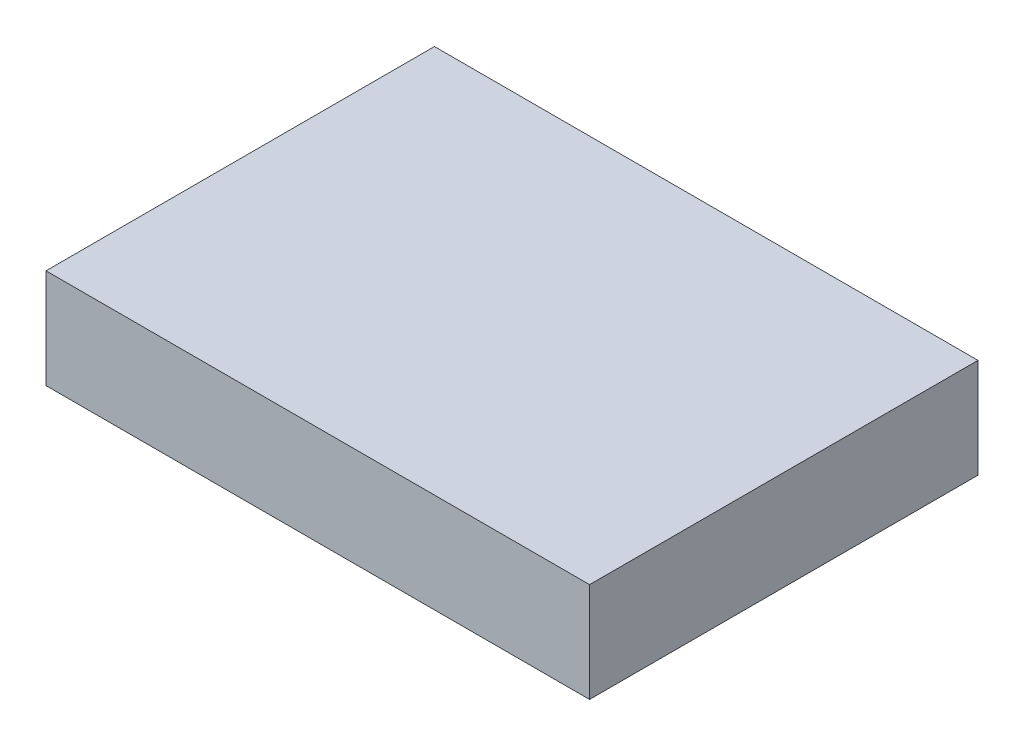
ISO-10303-21;
HEADER;
FILE_DESCRIPTION(('STEP AP214'),'2;1');
FILE_NAME('part.step','',(''),(''),'','','');
FILE_SCHEMA(('AUTOMOTIVE_DESIGN { 1 0 10303 214 1 1 1 1 }'));
ENDSEC;
DATA;
#1=APPLICATION_CONTEXT('core data for automotive mechanical design processes');
#2=APPLICATION_PROTOCOL_DEFINITION('international standard','automotive_design',2000,#1);
#3=PRODUCT_CONTEXT('',#1,'mechanical');
#4=PRODUCT('Part','Part','',(#3));
#5=PRODUCT_RELATED_PRODUCT_CATEGORY('part','',(#4));
#6=PRODUCT_DEFINITION_FORMATION('','',#4);
#7=PRODUCT_DEFINITION_CONTEXT('part definition',#1,'design');
#8=PRODUCT_DEFINITION('design','',#6,#7);
#9=PRODUCT_DEFINITION_SHAPE('','',#8);
#10=(LENGTH_UNIT() NAMED_UNIT(*) SI_UNIT(.MILLI.,.METRE.));
#11=(NAMED_UNIT(*) PLANE_ANGLE_UNIT() SI_UNIT($,.RADIAN.));
#12=(NAMED_UNIT(*) SI_UNIT($,.STERADIAN.) SOLID_ANGLE_UNIT());
#13=UNCERTAINTY_MEASURE_WITH_UNIT(LENGTH_MEASURE(1.E-05),#10,'distance_accuracy_value','');
#14=(GEOMETRIC_REPRESENTATION_CONTEXT(3) GLOBAL_UNCERTAINTY_ASSIGNED_CONTEXT((#13)) GLOBAL_UNIT_ASSIGNED_CONTEXT((#10,
#11,#12)) REPRESENTATION_CONTEXT('',''));
#15=CARTESIAN_POINT('',(0.,0.,0.));
#16=DIRECTION('',(0.,0.,1.));
#17=DIRECTION('',(1.,0.,0.));
#18=AXIS2_PLACEMENT_3D('',#15,#16,#17);
#19=CARTESIAN_POINT('',(-11.3817992223224,-0.235238182718216,92.8208640238827));
#20=DIRECTION('',(0.,-1.,0.));
#21=DIRECTION('',(1.,0.,0.));
#22=AXIS2_PLACEMENT_3D('',#19,#20,#21);
#23=PLANE('',#22);
#24=DIRECTION('',(-1.,0.,0.));
#25=VECTOR('',#24,1.);
#26=CARTESIAN_POINT('',(-132.075563950012,-0.235238182718224,76.5608640238827));
#27=LINE('',#26,#25);
#28=CARTESIAN_POINT('',(-32.1504797007613,-0.235238182700007,76.5608640238827));
#29=VERTEX_POINT('',#28);
#30=CARTESIAN_POINT('',(-132.07520257422,-0.235238183928669,76.5608238745016));
#31=VERTEX_POINT('',#30);
#32=EDGE_CURVE('E227',#29,#31,#27,.T.);
#33=ORIENTED_EDGE('',*,*,#32,.F.);
#34=CARTESIAN_POINT('',(-27.1842803763696,-0.235238182711097,11.5608640238827));
#35=CARTESIAN_POINT('',(-27.8205460887044,-0.235238182715701,19.8886150074807));
#36=CARTESIAN_POINT('',(-28.4568118010935,-0.235238182717568,28.2163659910745));
#37=CARTESIAN_POINT('',(-29.6026445446678,-0.235238182718738,43.2135748162056));
#38=CARTESIAN_POINT('',(-30.1122115758443,-0.235238182718478,49.8830326577435));
#39=CARTESIAN_POINT('',(-31.131345638197,-0.235238182717957,63.2219483408148));
#40=CARTESIAN_POINT('',(-31.6409126693732,-0.235238182717697,69.8914061823481));
#41=CARTESIAN_POINT('',(-32.1504797005339,-0.235238182718218,76.5608640238827));
#42=B_SPLINE_CURVE_WITH_KNOTS('',3,(#34,#35,#36,#37,#38,#39,#40,#41),.UNSPECIFIED.,.F.,.F.,(4,2,
2,4),(0.,25.0560658227422,45.1227530962764,65.1894403697971),.UNSPECIFIED.);
#43=CARTESIAN_POINT('',(-27.1842803764092,-0.235238182700006,11.5608640238827));
#44=VERTEX_POINT('',#43);
#45=EDGE_CURVE('E168',#44,#29,#42,.T.);
#46=ORIENTED_EDGE('',*,*,#45,.F.);
#47=DIRECTION('',(1.,0.,0.));
#48=VECTOR('',#47,1.);
#49=CARTESIAN_POINT('',(-107.12440167271,-0.235238182718223,11.5608640238827));
#50=LINE('',#49,#48);
#51=CARTESIAN_POINT('',(-107.12440167271,-0.235238182718223,11.5608640238827));
#52=VERTEX_POINT('',#51);
#53=EDGE_CURVE('E177',#52,#44,#50,.T.);
#54=ORIENTED_EDGE('',*,*,#53,.F.);
#55=DIRECTION('',(0.358367949545301,0.,-0.933580426497202));
#56=VECTOR('',#55,1.);
#57=CARTESIAN_POINT('',(-132.075563950012,-0.235238182718224,76.5608640238827));
#58=LINE('',#57,#56);
#59=CARTESIAN_POINT('',(-128.946982261469,-0.235238182718224,68.4106300790571));
#60=VERTEX_POINT('',#59);
#61=EDGE_CURVE('E224',#60,#52,#58,.T.);
#62=ORIENTED_EDGE('',*,*,#61,.F.);
#63=CARTESIAN_POINT('',(-132.075140131394,-0.235238192401783,76.5608640238827));
#64=CARTESIAN_POINT('',(-131.944803104205,-0.235244352036653,76.2212708155646));
#65=CARTESIAN_POINT('',(-131.814465743619,-0.235249748367331,75.8816777351916));
#66=CARTESIAN_POINT('',(-131.553790269325,-0.23525900940596,75.2024915744453));
#67=CARTESIAN_POINT('',(-131.423452155616,-0.235262874112775,74.8628984940723));
#68=CARTESIAN_POINT('',(-131.162775186959,-0.235269066882442,74.1837123333286));
#69=CARTESIAN_POINT('',(-131.03243633201,-0.235271394944172,73.8441192529581));
#70=CARTESIAN_POINT('',(-130.771757892799,-0.235274509394278,73.1649330922188));
#71=CARTESIAN_POINT('',(-130.641418308537,-0.235275295781546,72.8253400118502));
#72=CARTESIAN_POINT('',(-130.380738422663,-0.235275321847395,72.1461538511148));
#73=CARTESIAN_POINT('',(-130.25039812105,-0.235274561524883,71.8065607707483));
#74=CARTESIAN_POINT('',(-129.989716812471,-0.235271489129163,71.1273746100169));
#75=CARTESIAN_POINT('',(-129.859375805504,-0.235269177054877,70.7877815296522));
#76=CARTESIAN_POINT('',(-129.598693098252,-0.235262996107686,70.1085953689253));
#77=CARTESIAN_POINT('',(-129.468351397965,-0.235259127233717,69.7690022885631));
#78=CARTESIAN_POINT('',(-129.207667316147,-0.235249827631053,69.0898161278387));
#79=CARTESIAN_POINT('',(-129.077324934617,-0.235244396901309,68.7502230474766));
#80=CARTESIAN_POINT('',(-128.946982261469,-0.235238182718224,68.4106300790572));
#81=B_SPLINE_CURVE_WITH_KNOTS('',3,(#63,#64,#65,#66,#67,#68,#69,#70,#71,#72,#73,#74,#75,#76,#77,
#78,#79,#80),.UNSPECIFIED.,.F.,.F.,(4,2,2,2,2,2,2,2,4),(0.,1.09123855800144,2.18247792552253,
3.27371808980577,4.36495903805465,5.45620075743391,6.5474432350696,7.63868645804878,
8.72993041341967),.UNSPECIFIED.);
#82=EDGE_CURVE('E176',#31,#60,#81,.T.);
#83=ORIENTED_EDGE('',*,*,#82,.F.);
#84=EDGE_LOOP('',(#33,#46,#54,#62,#83));
#85=FACE_BOUND('',#84,.T.);
#86=DIRECTION('',(1.,0.,0.));
#87=VECTOR('',#86,1.);
#88=CARTESIAN_POINT('',(0.,-0.235238182718216,92.8108640238827));
#89=LINE('',#88,#87);
#90=CARTESIAN_POINT('',(-147.817686381932,-0.235238182718221,92.8108640238827));
#91=VERTEX_POINT('',#90);
#92=CARTESIAN_POINT('',(-11.3817992223224,-0.235238182718221,92.8108640238827));
#93=VERTEX_POINT('',#92);
#94=EDGE_CURVE('E128',#91,#93,#89,.T.);
#95=ORIENTED_EDGE('',*,*,#94,.F.);
#96=DIRECTION('',(0.,0.,-1.));
#97=VECTOR('',#96,1.);
#98=CARTESIAN_POINT('',(-147.817686381932,-0.235238182718228,92.8108640238827));
#99=LINE('',#98,#97);
#100=CARTESIAN_POINT('',(-147.817686381932,-0.235238182718221,-4.68913597611728));
#101=VERTEX_POINT('',#100);
#102=EDGE_CURVE('E119',#91,#101,#99,.T.);
#103=ORIENTED_EDGE('',*,*,#102,.T.);
#104=DIRECTION('',(1.,0.,0.));
#105=VECTOR('',#104,1.);
#106=CARTESIAN_POINT('',(0.,-0.235238182718216,-4.68913597611728));
#107=LINE('',#106,#105);
#108=CARTESIAN_POINT('',(-11.3817992223224,-0.235238182718221,-4.68913597611728));
#109=VERTEX_POINT('',#108);
#110=EDGE_CURVE('E127',#101,#109,#107,.T.);
#111=ORIENTED_EDGE('',*,*,#110,.T.);
#112=DIRECTION('',(0.,0.,1.));
#113=VECTOR('',#112,1.);
#114=CARTESIAN_POINT('',(-11.3817992223224,-0.235238182718218,92.8108640238827));
#115=LINE('',#114,#113);
#116=EDGE_CURVE('E129',#109,#93,#115,.T.);
#117=ORIENTED_EDGE('',*,*,#116,.T.);
#118=EDGE_LOOP('',(#95,#103,#111,#117));
#119=FACE_BOUND('',#118,.T.);
#120=ADVANCED_FACE('F37',(#85,#119),#23,.T.);
#121=CARTESIAN_POINT('',(-107.075563950012,1.75875961669354,76.5608640238827));
#122=CARTESIAN_POINT('',(-100.615543707822,1.75875967213758,54.8941973572161));
#123=CARTESIAN_POINT('',(-94.155523465631,1.75875972758162,33.2275306905494));
#124=CARTESIAN_POINT('',(-87.6955032234404,1.75875978302566,11.5608640238827));
#125=CARTESIAN_POINT('',(-108.132383930033,1.75875961669354,76.5608640238827));
#126=CARTESIAN_POINT('',(-101.5955542746,1.75855832027065,54.8941973572161));
#127=CARTESIAN_POINT('',(-95.0587246191672,1.75835702384777,33.2275306905494));
#128=CARTESIAN_POINT('',(-88.5218949637344,1.75815572742488,11.5608640238827));
#129=CARTESIAN_POINT('',(-110.246005887302,1.75336921642837,76.5608640238827));
#130=CARTESIAN_POINT('',(-103.555556738654,1.75279611023587,54.8941973572161));
#131=CARTESIAN_POINT('',(-96.8651075900062,1.75222300404337,33.2275306905494));
#132=CARTESIAN_POINT('',(-90.1746584413585,1.75164989785087,11.5608640238827));
#133=CARTESIAN_POINT('',(-112.887963677642,1.73016879013537,76.5608640238827));
#134=CARTESIAN_POINT('',(-106.005477018413,1.72921258535773,54.8941973572161));
#135=CARTESIAN_POINT('',(-99.1229903591834,1.7282563805801,33.2275306905494));
#136=CARTESIAN_POINT('',(-92.240503699954,1.72730017580246,11.5608640238827));
#137=CARTESIAN_POINT('',(-115.001368678906,1.69910722309658,76.5608640238827));
#138=CARTESIAN_POINT('',(-107.965239511763,1.69790843277764,54.8941973572161));
#139=CARTESIAN_POINT('',(-100.92911034462,1.6967096424587,33.2275306905494));
#140=CARTESIAN_POINT('',(-93.8929811774769,1.69551085213977,11.5608640238827));
#141=CARTESIAN_POINT('',(-116.586302633544,1.66862052283434,76.5608640238827));
#142=CARTESIAN_POINT('',(-109.434927641679,1.66725902412545,54.8941973572161));
#143=CARTESIAN_POINT('',(-102.283552649815,1.66589752541655,33.2275306905494));
#144=CARTESIAN_POINT('',(-95.1321776579501,1.66453602670766,11.5608640238828));
#145=CARTESIAN_POINT('',(-118.171058876268,1.62985533130235,76.5608640238828));
#146=CARTESIAN_POINT('',(-110.904422666766,1.62838699050735,54.8941973572161));
#147=CARTESIAN_POINT('',(-103.637786457264,1.62691864971235,33.2275306905494));
#148=CARTESIAN_POINT('',(-96.3711502477621,1.62545030891734,11.5608640238827));
#149=CARTESIAN_POINT('',(-119.755544293578,1.5813483819962,76.5608640238826));
#150=CARTESIAN_POINT('',(-112.373621060574,1.57977114390554,54.894197357216));
#151=CARTESIAN_POINT('',(-104.99169782757,1.57819390581488,33.2275306905493));
#152=CARTESIAN_POINT('',(-97.6097745945666,1.57661666772421,11.5608640238827));
#153=CARTESIAN_POINT('',(-121.339645079935,1.52119708080297,76.5608640238828));
#154=CARTESIAN_POINT('',(-113.842405501962,1.51959741122986,54.8941973572161));
#155=CARTESIAN_POINT('',(-106.34516592399,1.51799774165676,33.2275306905495));
#156=CARTESIAN_POINT('',(-98.8479263460174,1.51639807208366,11.5608640238828));
#157=CARTESIAN_POINT('',(-122.923126011693,1.446760312623,76.5608640238827));
#158=CARTESIAN_POINT('',(-115.310497231239,1.44509430816232,54.894197357216));
#159=CARTESIAN_POINT('',(-107.697868450784,1.44342830370164,33.2275306905493));
#160=CARTESIAN_POINT('',(-100.085239670329,1.44176229924096,11.5608640238827));
#161=CARTESIAN_POINT('',(-124.505704617774,1.3542675333516,76.5608640238827));
#162=CARTESIAN_POINT('',(-116.777639731571,1.35269475971289,54.8941973572161));
#163=CARTESIAN_POINT('',(-109.049574845368,1.35112198607418,33.2275306905494));
#164=CARTESIAN_POINT('',(-101.321509959166,1.34954921243548,11.5608640238827));
#165=CARTESIAN_POINT('',(-126.086665290918,1.23791529552961,76.5608640238828));
#166=CARTESIAN_POINT('',(-118.242945309122,1.23621539599588,54.8941973572161));
#167=CARTESIAN_POINT('',(-110.399225327326,1.23451549646215,33.2275306905494));
#168=CARTESIAN_POINT('',(-102.55550534553,1.23281559692842,11.5608640238827));
#169=CARTESIAN_POINT('',(-127.401971271798,1.11310628948222,76.5608640238826));
#170=CARTESIAN_POINT('',(-119.461778265511,1.11166815376252,54.894197357216));
#171=CARTESIAN_POINT('',(-111.521585259223,1.11023001804283,33.2275306905494));
#172=CARTESIAN_POINT('',(-103.581392252936,1.10879188232313,11.5608640238827));
#173=CARTESIAN_POINT('',(-128.451211664432,0.98740266496104,76.5608640238828));
#174=CARTESIAN_POINT('',(-120.433449756428,0.985678699985937,54.8941973572161));
#175=CARTESIAN_POINT('',(-112.415687848424,0.983954735010835,33.2275306905494));
#176=CARTESIAN_POINT('',(-104.39792594042,0.982230770035732,11.5608640238827));
#177=CARTESIAN_POINT('',(-129.105328981432,0.89380716212721,76.5608640238827));
#178=CARTESIAN_POINT('',(-121.038811874524,0.891931663153669,54.894197357216));
#179=CARTESIAN_POINT('',(-112.972294767617,0.890056164180128,33.2275306905494));
#180=CARTESIAN_POINT('',(-104.905777660709,0.888180665206587,11.5608640238827));
#181=CARTESIAN_POINT('',(-129.626242660876,0.807190128288318,76.5608640238827));
#182=CARTESIAN_POINT('',(-121.520870039012,0.805405693830426,54.894197357216));
#183=CARTESIAN_POINT('',(-113.415497417147,0.803621259372533,33.2275306905494));
#184=CARTESIAN_POINT('',(-105.310124795283,0.801836824914641,11.5608640238827));
#185=CARTESIAN_POINT('',(-130.146277709311,0.708863786340714,76.5608640238828));
#186=CARTESIAN_POINT('',(-122.001450344241,0.707410654839306,54.8941973572161));
#187=CARTESIAN_POINT('',(-113.856622979171,0.705957523337899,33.2275306905494));
#188=CARTESIAN_POINT('',(-105.711795614101,0.704504391836491,11.5608640238827));
#189=CARTESIAN_POINT('',(-130.789114253045,0.564934013855771,76.5608640238826));
#190=CARTESIAN_POINT('',(-122.594831420566,0.561793116929288,54.894197357216));
#191=CARTESIAN_POINT('',(-114.400548588088,0.558652220002804,33.2275306905493));
#192=CARTESIAN_POINT('',(-106.206265755609,0.555511323076321,11.5608640238827));
#193=CARTESIAN_POINT('',(-131.421716741126,0.358137389091872,76.5608640238828));
#194=CARTESIAN_POINT('',(-123.175692476698,0.356141962260332,54.8941973572161));
#195=CARTESIAN_POINT('',(-114.929668212271,0.354146535428791,33.2275306905494));
#196=CARTESIAN_POINT('',(-106.683643947843,0.352151108597251,11.5608640238827));
#197=CARTESIAN_POINT('',(-131.88591222293,0.110037862171926,76.5608640238827));
#198=CARTESIAN_POINT('',(-123.596144266275,0.107103002439895,54.894197357216));
#199=CARTESIAN_POINT('',(-115.30637630962,0.104168142707863,33.2275306905494));
#200=CARTESIAN_POINT('',(-107.016608352966,0.101233282975832,11.5608640238827));
#201=CARTESIAN_POINT('',(-132.067530971164,-0.109382349431996,76.5608640238827));
#202=CARTESIAN_POINT('',(-123.751065411797,-0.103009150963636,54.8941973572161));
#203=CARTESIAN_POINT('',(-115.43459985243,-0.0966359524952752,33.2275306905494));
#204=CARTESIAN_POINT('',(-107.118134293063,-0.0902627540269145,11.5608640238827));
#205=CARTESIAN_POINT('',(-132.075563950012,-0.241240383306461,76.5608640238827));
#206=CARTESIAN_POINT('',(-123.758509857578,-0.225284070850624,54.8941973572161));
#207=CARTESIAN_POINT('',(-115.441455765144,-0.209327758394787,33.2275306905494));
#208=CARTESIAN_POINT('',(-107.12440167271,-0.193371445938949,11.5608640238827));
#209=B_SPLINE_SURFACE_WITH_KNOTS('',3,3,((#121,#122,#123,#124),(#125,#126,#127,#128),(#129,#130,
#131,#132),(#133,#134,#135,#136),(#137,#138,#139,#140),(#141,#142,#143,#144),(#145,#146,#147,
#148),(#149,#150,#151,#152),(#153,#154,#155,#156),(#157,#158,#159,#160),(#161,#162,#163,#164),
(#165,#166,#167,#168),(#169,#170,#171,#172),(#173,#174,#175,#176),(#177,#178,#179,#180),(#181,
#182,#183,#184),(#185,#186,#187,#188),(#189,#190,#191,#192),(#193,#194,#195,#196),(#197,#198,
#199,#200),(#201,#202,#203,#204),(#205,#206,#207,#208)),.UNSPECIFIED.,.F.,.F.,.F.,(4,1,1,1,1,1,
1,1,1,1,1,1,1,1,1,1,1,1,1,4),(4,4),(0.474415888325319,0.534766474857656,0.595117061389994,
0.625292354656163,0.655467647922332,0.685642941188501,0.71581823445467,0.745993527720838,
0.776168820987007,0.806344114253176,0.836519407519345,0.866694700785514,0.881782347418598,
0.896869994051683,0.904413817368225,0.911957640684767,0.927045287317851,0.942132933950936,
0.949676757267478,0.95722058058402),(0.,1.),.UNSPECIFIED.);
#210=CARTESIAN_POINT('',(-107.075563950012,1.75875961669354,76.5608640238827));
#211=CARTESIAN_POINT('',(-108.132383930033,1.75875961669354,76.5608640238827));
#212=CARTESIAN_POINT('',(-110.246005887302,1.75336921642837,76.5608640238827));
#213=CARTESIAN_POINT('',(-112.887963677642,1.73016879013537,76.5608640238827));
#214=CARTESIAN_POINT('',(-115.001368678906,1.69910722309658,76.5608640238827));
#215=CARTESIAN_POINT('',(-116.586302633544,1.66862052283434,76.5608640238827));
#216=CARTESIAN_POINT('',(-118.171058876268,1.62985533130235,76.5608640238828));
#217=CARTESIAN_POINT('',(-119.755544293578,1.5813483819962,76.5608640238826));
#218=CARTESIAN_POINT('',(-121.339645079935,1.52119708080297,76.5608640238828));
#219=CARTESIAN_POINT('',(-122.923126011693,1.446760312623,76.5608640238827));
#220=CARTESIAN_POINT('',(-124.505704617774,1.3542675333516,76.5608640238827));
#221=CARTESIAN_POINT('',(-126.086665290918,1.23791529552961,76.5608640238828));
#222=CARTESIAN_POINT('',(-127.401971271798,1.11310628948222,76.5608640238826));
#223=CARTESIAN_POINT('',(-128.451211664432,0.98740266496104,76.5608640238828));
#224=CARTESIAN_POINT('',(-129.105328981432,0.89380716212721,76.5608640238827));
#225=CARTESIAN_POINT('',(-129.626242660876,0.807190128288318,76.5608640238827));
#226=CARTESIAN_POINT('',(-130.146277709311,0.708863786340714,76.5608640238828));
#227=CARTESIAN_POINT('',(-130.789114253045,0.564934013855771,76.5608640238826));
#228=CARTESIAN_POINT('',(-131.421716741126,0.358137389091872,76.5608640238828));
#229=CARTESIAN_POINT('',(-131.88591222293,0.110037862171926,76.5608640238827));
#230=CARTESIAN_POINT('',(-132.067530971164,-0.109382349431996,76.5608640238827));
#231=CARTESIAN_POINT('',(-132.075563950012,-0.241240383306461,76.5608640238827));
#232=B_SPLINE_CURVE_WITH_KNOTS('',3,(#210,#211,#212,#213,#214,#215,#216,#217,#218,#219,#220,
#221,#222,#223,#224,#225,#226,#227,#228,#229,#230,#231),.UNSPECIFIED.,.F.,.F.,(4,1,1,1,1,1,1,1,
1,1,1,1,1,1,1,1,1,1,1,4),(0.474415888325319,0.534766474857656,0.595117061389994,
0.625292354656163,0.655467647922332,0.685642941188501,0.71581823445467,0.745993527720838,
0.776168820987007,0.806344114253176,0.836519407519345,0.866694700785514,0.881782347418598,
0.896869994051683,0.904413817368225,0.911957640684767,0.927045287317851,0.942132933950936,
0.949676757267478,0.95722058058402),.UNSPECIFIED.);
#233=CARTESIAN_POINT('',(-107.075563950012,1.75875961669354,76.5608640238827));
#234=VERTEX_POINT('',#233);
#235=EDGE_CURVE('E207',#31,#234,#232,.F.);
#236=CARTESIAN_POINT('',(-132.075563950012,-0.241240383306461,76.5608640238827));
#237=CARTESIAN_POINT('',(-123.758509857578,-0.225284070850624,54.8941973572161));
#238=CARTESIAN_POINT('',(-115.441455765144,-0.209327758394787,33.2275306905494));
#239=CARTESIAN_POINT('',(-107.12440167271,-0.193371445938949,11.5608640238827));
#240=B_SPLINE_CURVE_WITH_KNOTS('',3,(#236,#237,#238,#239),.UNSPECIFIED.,.F.,.F.,(4,4),(0.,1.),.UNSPECIFIED.);
#241=CARTESIAN_POINT('',(-107.12440167271,-0.193371445938949,11.5608640238827));
#242=VERTEX_POINT('',#241);
#243=EDGE_CURVE('E279',#60,#242,#240,.T.);
#244=CARTESIAN_POINT('',(-107.12440167271,-0.193371445938949,11.5608640238827));
#245=CARTESIAN_POINT('',(-107.118134293063,-0.0902627540269145,11.5608640238827));
#246=CARTESIAN_POINT('',(-107.016608352966,0.101233282975832,11.5608640238827));
#247=CARTESIAN_POINT('',(-106.683643947843,0.352151108597251,11.5608640238827));
#248=CARTESIAN_POINT('',(-106.206265755609,0.555511323076321,11.5608640238827));
#249=CARTESIAN_POINT('',(-105.711795614101,0.704504391836491,11.5608640238827));
#250=CARTESIAN_POINT('',(-105.310124795283,0.801836824914641,11.5608640238827));
#251=CARTESIAN_POINT('',(-104.905777660709,0.888180665206587,11.5608640238827));
#252=CARTESIAN_POINT('',(-104.39792594042,0.982230770035732,11.5608640238827));
#253=CARTESIAN_POINT('',(-103.581392252936,1.10879188232313,11.5608640238827));
#254=CARTESIAN_POINT('',(-102.55550534553,1.23281559692842,11.5608640238827));
#255=CARTESIAN_POINT('',(-101.321509959166,1.34954921243548,11.5608640238827));
#256=CARTESIAN_POINT('',(-100.085239670329,1.44176229924096,11.5608640238827));
#257=CARTESIAN_POINT('',(-98.8479263460174,1.51639807208366,11.5608640238828));
#258=CARTESIAN_POINT('',(-97.6097745945666,1.57661666772421,11.5608640238827));
#259=CARTESIAN_POINT('',(-96.3711502477621,1.62545030891734,11.5608640238827));
#260=CARTESIAN_POINT('',(-95.1321776579501,1.66453602670766,11.5608640238828));
#261=CARTESIAN_POINT('',(-93.8929811774769,1.69551085213977,11.5608640238827));
#262=CARTESIAN_POINT('',(-92.240503699954,1.72730017580246,11.5608640238827));
#263=CARTESIAN_POINT('',(-90.1746584413585,1.75164989785087,11.5608640238827));
#264=CARTESIAN_POINT('',(-88.5218949637344,1.75815572742488,11.5608640238827));
#265=CARTESIAN_POINT('',(-87.6955032234404,1.75875978302566,11.5608640238827));
#266=B_SPLINE_CURVE_WITH_KNOTS('',3,(#244,#245,#246,#247,#248,#249,#250,#251,#252,#253,#254,
#255,#256,#257,#258,#259,#260,#261,#262,#263,#264,#265),.UNSPECIFIED.,.F.,.F.,(4,1,1,1,1,1,1,1,
1,1,1,1,1,1,1,1,1,1,1,4),(0.474415888325319,0.481959711641861,0.489503534958403,
0.504591181591488,0.519678828224572,0.527222651541114,0.534766474857656,0.549854121490741,
0.564941768123825,0.595117061389994,0.625292354656163,0.655467647922332,0.685642941188501,
0.71581823445467,0.745993527720838,0.776168820987007,0.806344114253176,0.836519407519345,
0.896869994051683,0.95722058058402),.UNSPECIFIED.);
#267=CARTESIAN_POINT('',(-87.6956169548082,1.75875961669354,11.5608640238827));
#268=VERTEX_POINT('',#267);
#269=EDGE_CURVE('E271',#242,#268,#266,.T.);
#270=CARTESIAN_POINT('',(-107.075563950012,1.75875961669354,76.5608640238827));
#271=CARTESIAN_POINT('',(-100.615543707822,1.75875967213758,54.8941973572161));
#272=CARTESIAN_POINT('',(-94.155523465631,1.75875972758162,33.2275306905494));
#273=CARTESIAN_POINT('',(-87.6955032234404,1.75875978302566,11.5608640238827));
#274=B_SPLINE_CURVE_WITH_KNOTS('',3,(#270,#271,#272,#273),.UNSPECIFIED.,.F.,.F.,(4,4),(0.,1.),.UNSPECIFIED.);
#275=EDGE_CURVE('E208',#234,#268,#274,.T.);
#276=ORIENTED_EDGE('',*,*,#235,.F.);
#277=ORIENTED_EDGE('',*,*,#82,.T.);
#278=ORIENTED_EDGE('',*,*,#243,.T.);
#279=ORIENTED_EDGE('',*,*,#269,.T.);
#280=ORIENTED_EDGE('',*,*,#275,.F.);
#281=EDGE_LOOP('',(#276,#277,#278,#279,#280));
#282=FACE_BOUND('',#281,.T.);
#283=ADVANCED_FACE('F157',(#282),#209,.T.);
#284=CARTESIAN_POINT('',(-73.7693626848444,1.75875961669354,40.4497529127716));
#285=DIRECTION('',(0.,-1.,0.));
#286=DIRECTION('',(0.,0.,-1.));
#287=AXIS2_PLACEMENT_3D('',#284,#285,#286);
#288=PLANE('',#287);
#289=DIRECTION('',(1.,0.,0.));
#290=VECTOR('',#289,1.);
#291=CARTESIAN_POINT('',(-132.075563950012,1.75875961669354,76.5608640238827));
#292=LINE('',#291,#290);
#293=CARTESIAN_POINT('',(-82.0755639500123,1.75875961669354,76.5608640238827));
#294=VERTEX_POINT('',#293);
#295=EDGE_CURVE('E290',#234,#294,#292,.T.);
#296=ORIENTED_EDGE('',*,*,#295,.F.);
#297=ORIENTED_EDGE('',*,*,#275,.T.);
#298=DIRECTION('',(-1.,0.,0.));
#299=VECTOR('',#298,1.);
#300=CARTESIAN_POINT('',(-107.12440167271,1.75875961669354,11.5608640238827));
#301=LINE('',#300,#299);
#302=CARTESIAN_POINT('',(-67.1244016727102,1.75875961669354,11.5608640238827));
#303=VERTEX_POINT('',#302);
#304=EDGE_CURVE('E295',#303,#268,#301,.T.);
#305=ORIENTED_EDGE('',*,*,#304,.F.);
#306=CARTESIAN_POINT('',(-82.0755639500123,1.75875961669354,76.5608640238827));
#307=CARTESIAN_POINT('',(-77.0918431909116,1.75875961669354,54.8941973572161));
#308=CARTESIAN_POINT('',(-72.1081224318109,1.75875961669354,33.2275306905494));
#309=CARTESIAN_POINT('',(-67.1244016727102,1.75875961669354,11.5608640238827));
#310=B_SPLINE_CURVE_WITH_KNOTS('',3,(#306,#307,#308,#309),.UNSPECIFIED.,.F.,.F.,(4,4),(0.,1.),.UNSPECIFIED.);
#311=EDGE_CURVE('E75',#294,#303,#310,.T.);
#312=ORIENTED_EDGE('',*,*,#311,.F.);
#313=EDGE_LOOP('',(#296,#297,#305,#312));
#314=FACE_BOUND('',#313,.T.);
#315=ADVANCED_FACE('F244',(#314),#288,.T.);
#316=CARTESIAN_POINT('',(-32.0755639500123,-0.241240383306461,76.5608640238827));
#317=CARTESIAN_POINT('',(-30.4251765242449,-0.241240383306461,54.8941973572161));
#318=CARTESIAN_POINT('',(-28.7747890984775,-0.241240383306461,33.2275306905494));
#319=CARTESIAN_POINT('',(-27.1244016727102,-0.241240383306461,11.5608640238827));
#320=CARTESIAN_POINT('',(-36.2328863128886,0.0920929500268473,76.5608640238827));
#321=CARTESIAN_POINT('',(-34.3043455878615,0.0920929500268556,54.8941973572161));
#322=CARTESIAN_POINT('',(-32.3758048628345,0.0920929500268634,33.2275306905494));
#323=CARTESIAN_POINT('',(-30.4472641378075,0.0920929500268716,11.5608640238827));
#324=CARTESIAN_POINT('',(-44.5522031905363,0.675426283360143,76.5608640238827));
#325=CARTESIAN_POINT('',(-42.0675436277309,0.675426283360164,54.8941973572161));
#326=CARTESIAN_POINT('',(-39.5828840649255,0.675426283360184,33.2275306905494));
#327=CARTESIAN_POINT('',(-37.0982245021201,0.675426283360204,11.5608640238827));
#328=CARTESIAN_POINT('',(-57.0451949626936,1.30042628336013,76.5608640238827));
#329=CARTESIAN_POINT('',(-53.7269204254434,1.30042628336015,54.894197357216));
#330=CARTESIAN_POINT('',(-50.4086458881933,1.30042628336018,33.2275306905493));
#331=CARTESIAN_POINT('',(-47.0903713509431,1.3004262833602,11.5608640238827));
#332=CARTESIAN_POINT('',(-69.5522031905364,1.67542628336014,76.5608640238827));
#333=CARTESIAN_POINT('',(-65.4008769610643,1.67542628336016,54.8941973572161));
#334=CARTESIAN_POINT('',(-61.2495507315922,1.67542628336018,33.2275306905494));
#335=CARTESIAN_POINT('',(-57.0982245021201,1.6754262833602,11.5608640238828));
#336=CARTESIAN_POINT('',(-77.8995529795552,1.75875961669351,76.5608640238827));
#337=CARTESIAN_POINT('',(-73.1932344767504,1.75875961669352,54.8941973572161));
#338=CARTESIAN_POINT('',(-68.4869159739456,1.75875961669353,33.2275306905494));
#339=CARTESIAN_POINT('',(-63.7805974711408,1.75875961669354,11.5608640238827));
#340=CARTESIAN_POINT('',(-82.0755639500123,1.75875961669354,76.5608640238827));
#341=CARTESIAN_POINT('',(-77.0918431909116,1.75875961669354,54.8941973572161));
#342=CARTESIAN_POINT('',(-72.1081224318109,1.75875961669354,33.2275306905494));
#343=CARTESIAN_POINT('',(-67.1244016727102,1.75875961669354,11.5608640238827));
#344=B_SPLINE_SURFACE_WITH_KNOTS('',3,3,((#316,#317,#318,#319),(#320,#321,#322,#323),(#324,#325,
#326,#327),(#328,#329,#330,#331),(#332,#333,#334,#335),(#336,#337,#338,#339),(#340,#341,#342,
#343)),.UNSPECIFIED.,.F.,.F.,.F.,(4,1,1,1,4),(4,4),(0.,0.122335441753358,0.244670883506716,
0.367006325260075,0.489341767013433),(0.,1.),.UNSPECIFIED.);
#345=CARTESIAN_POINT('',(-67.1244016727102,1.75875961669354,11.5608640238827));
#346=CARTESIAN_POINT('',(-47.0615764632941,1.75875961669354,11.5608640238827));
#347=CARTESIAN_POINT('',(-27.1244016727102,-0.241240383306461,11.5608640238827));
#348=B_SPLINE_CURVE_WITH_KNOTS('',2,(#345,#346,#347),.UNSPECIFIED.,.F.,.F.,(3,3),(0.,1.),.UNSPECIFIED.);
#349=EDGE_CURVE('E202',#303,#44,#348,.T.);
#350=CARTESIAN_POINT('',(-82.0755639500123,1.75875961669354,76.5608640238827));
#351=CARTESIAN_POINT('',(-57.0194981272701,1.75875961669339,76.5608640238827));
#352=CARTESIAN_POINT('',(-32.0755639500123,-0.241240383306461,76.5608640238827));
#353=B_SPLINE_CURVE_WITH_KNOTS('',2,(#350,#351,#352),.UNSPECIFIED.,.F.,.F.,(3,3),(0.,1.),.UNSPECIFIED.);
#354=EDGE_CURVE('E203',#294,#29,#353,.T.);
#355=ORIENTED_EDGE('',*,*,#349,.T.);
#356=ORIENTED_EDGE('',*,*,#45,.T.);
#357=ORIENTED_EDGE('',*,*,#354,.F.);
#358=ORIENTED_EDGE('',*,*,#311,.T.);
#359=EDGE_LOOP('',(#355,#356,#357,#358));
#360=FACE_BOUND('',#359,.T.);
#361=ADVANCED_FACE('F161',(#360),#344,.T.);
#362=CARTESIAN_POINT('',(-132.075563950012,1.75875961669354,76.5608640238827));
#363=DIRECTION('',(0.933580426497201,0.,0.358367949545301));
#364=DIRECTION('',(0.358367949545301,0.,-0.933580426497201));
#365=AXIS2_PLACEMENT_3D('',#362,#363,#364);
#366=PLANE('',#365);
#367=ORIENTED_EDGE('',*,*,#243,.F.);
#368=ORIENTED_EDGE('',*,*,#61,.T.);
#369=DIRECTION('',(0.,-1.,0.));
#370=VECTOR('',#369,1.);
#371=CARTESIAN_POINT('',(-107.12440167271,1.75875961669354,11.5608640238827));
#372=LINE('',#371,#370);
#373=EDGE_CURVE('E183',#242,#52,#372,.T.);
#374=ORIENTED_EDGE('',*,*,#373,.F.);
#375=EDGE_LOOP('',(#367,#368,#374));
#376=FACE_BOUND('',#375,.T.);
#377=ADVANCED_FACE('F314',(#376),#366,.T.);
#378=CARTESIAN_POINT('',(-107.12440167271,1.75875961669354,11.5608640238827));
#379=DIRECTION('',(0.,0.,1.));
#380=DIRECTION('',(1.,0.,0.));
#381=AXIS2_PLACEMENT_3D('',#378,#379,#380);
#382=PLANE('',#381);
#383=ORIENTED_EDGE('',*,*,#373,.T.);
#384=ORIENTED_EDGE('',*,*,#53,.T.);
#385=ORIENTED_EDGE('',*,*,#349,.F.);
#386=ORIENTED_EDGE('',*,*,#304,.T.);
#387=ORIENTED_EDGE('',*,*,#269,.F.);
#388=EDGE_LOOP('',(#383,#384,#385,#386,#387));
#389=FACE_BOUND('',#388,.T.);
#390=ADVANCED_FACE('F313',(#389),#382,.T.);
#391=CARTESIAN_POINT('',(-132.075563950012,1.75875961669354,76.5608640238827));
#392=DIRECTION('',(0.,0.,-1.));
#393=DIRECTION('',(-1.,0.,0.));
#394=AXIS2_PLACEMENT_3D('',#391,#392,#393);
#395=PLANE('',#394);
#396=ORIENTED_EDGE('',*,*,#354,.T.);
#397=ORIENTED_EDGE('',*,*,#32,.T.);
#398=ORIENTED_EDGE('',*,*,#235,.T.);
#399=ORIENTED_EDGE('',*,*,#295,.T.);
#400=EDGE_LOOP('',(#396,#397,#398,#399));
#401=FACE_BOUND('',#400,.T.);
#402=ADVANCED_FACE('F288',(#401),#395,.T.);
#403=CARTESIAN_POINT('',(-147.817686381932,24.7272480636052,92.8108640238827));
#404=DIRECTION('',(1.,0.,0.));
#405=DIRECTION('',(0.,0.,-1.));
#406=AXIS2_PLACEMENT_3D('',#403,#404,#405);
#407=PLANE('',#406);
#408=ORIENTED_EDGE('',*,*,#102,.F.);
#409=DIRECTION('',(0.,-1.,0.));
#410=VECTOR('',#409,1.);
#411=CARTESIAN_POINT('',(-147.817686381932,24.7272480636052,92.8108640238827));
#412=LINE('',#411,#410);
#413=CARTESIAN_POINT('',(-147.817686381932,24.7272480636052,92.8108640238827));
#414=VERTEX_POINT('',#413);
#415=EDGE_CURVE('E137',#414,#91,#412,.T.);
#416=ORIENTED_EDGE('',*,*,#415,.F.);
#417=DIRECTION('',(0.,0.,-1.));
#418=VECTOR('',#417,1.);
#419=CARTESIAN_POINT('',(-147.817686381932,24.7272480636052,92.8108640238827));
#420=LINE('',#419,#418);
#421=CARTESIAN_POINT('',(-147.817686381932,24.7272480636052,-4.68913597611728));
#422=VERTEX_POINT('',#421);
#423=EDGE_CURVE('E120',#414,#422,#420,.T.);
#424=ORIENTED_EDGE('',*,*,#423,.T.);
#425=DIRECTION('',(0.,-1.,0.));
#426=VECTOR('',#425,1.);
#427=CARTESIAN_POINT('',(-147.817686381932,24.7272480636052,-4.68913597611728));
#428=LINE('',#427,#426);
#429=EDGE_CURVE('E11',#422,#101,#428,.T.);
#430=ORIENTED_EDGE('',*,*,#429,.T.);
#431=EDGE_LOOP('',(#408,#416,#424,#430));
#432=FACE_BOUND('',#431,.T.);
#433=ADVANCED_FACE('F117',(#432),#407,.F.);
#434=CARTESIAN_POINT('',(-11.3817992223224,24.7272480636052,92.8108640238827));
#435=DIRECTION('',(-1.,0.,0.));
#436=DIRECTION('',(0.,0.,1.));
#437=AXIS2_PLACEMENT_3D('',#434,#435,#436);
#438=PLANE('',#437);
#439=ORIENTED_EDGE('',*,*,#116,.F.);
#440=DIRECTION('',(0.,1.,0.));
#441=VECTOR('',#440,1.);
#442=CARTESIAN_POINT('',(-11.3817992223224,24.7272480636052,-4.68913597611728));
#443=LINE('',#442,#441);
#444=CARTESIAN_POINT('',(-11.3817992223224,24.7272480636052,-4.68913597611728));
#445=VERTEX_POINT('',#444);
#446=EDGE_CURVE('E47',#109,#445,#443,.T.);
#447=ORIENTED_EDGE('',*,*,#446,.T.);
#448=DIRECTION('',(0.,0.,-1.));
#449=VECTOR('',#448,1.);
#450=CARTESIAN_POINT('',(-11.3817992223224,24.7272480636052,92.8108640238827));
#451=LINE('',#450,#449);
#452=CARTESIAN_POINT('',(-11.3817992223224,24.7272480636052,92.8108640238827));
#453=VERTEX_POINT('',#452);
#454=EDGE_CURVE('E181',#453,#445,#451,.T.);
#455=ORIENTED_EDGE('',*,*,#454,.F.);
#456=DIRECTION('',(0.,1.,0.));
#457=VECTOR('',#456,1.);
#458=CARTESIAN_POINT('',(-11.3817992223224,24.7272480636052,92.8108640238827));
#459=LINE('',#458,#457);
#460=EDGE_CURVE('E135',#93,#453,#459,.T.);
#461=ORIENTED_EDGE('',*,*,#460,.F.);
#462=EDGE_LOOP('',(#439,#447,#455,#461));
#463=FACE_BOUND('',#462,.T.);
#464=ADVANCED_FACE('F180',(#463),#438,.F.);
#465=CARTESIAN_POINT('',(0.,0.,92.8108640238827));
#466=DIRECTION('',(0.,0.,1.));
#467=DIRECTION('',(1.,0.,0.));
#468=AXIS2_PLACEMENT_3D('',#465,#466,#467);
#469=PLANE('',#468);
#470=ORIENTED_EDGE('',*,*,#415,.T.);
#471=ORIENTED_EDGE('',*,*,#94,.T.);
#472=ORIENTED_EDGE('',*,*,#460,.T.);
#473=DIRECTION('',(-1.,0.,0.));
#474=VECTOR('',#473,1.);
#475=CARTESIAN_POINT('',(-147.817686381932,24.7272480636052,92.8108640238827));
#476=LINE('',#475,#474);
#477=EDGE_CURVE('E67',#453,#414,#476,.T.);
#478=ORIENTED_EDGE('',*,*,#477,.T.);
#479=EDGE_LOOP('',(#470,#471,#472,#478));
#480=FACE_BOUND('',#479,.T.);
#481=ADVANCED_FACE('F39',(#480),#469,.T.);
#482=CARTESIAN_POINT('',(0.,0.,-4.68913597611728));
#483=DIRECTION('',(0.,0.,1.));
#484=DIRECTION('',(1.,0.,0.));
#485=AXIS2_PLACEMENT_3D('',#482,#483,#484);
#486=PLANE('',#485);
#487=ORIENTED_EDGE('',*,*,#110,.F.);
#488=ORIENTED_EDGE('',*,*,#429,.F.);
#489=DIRECTION('',(-1.,0.,0.));
#490=VECTOR('',#489,1.);
#491=CARTESIAN_POINT('',(-147.817686381932,24.7272480636052,-4.68913597611728));
#492=LINE('',#491,#490);
#493=EDGE_CURVE('E139',#445,#422,#492,.T.);
#494=ORIENTED_EDGE('',*,*,#493,.F.);
#495=ORIENTED_EDGE('',*,*,#446,.F.);
#496=EDGE_LOOP('',(#487,#488,#494,#495));
#497=FACE_BOUND('',#496,.T.);
#498=ADVANCED_FACE('F131',(#497),#486,.F.);
#499=CARTESIAN_POINT('',(-147.817686381932,24.7272480636052,92.8108640238827));
#500=DIRECTION('',(0.,-1.,0.));
#501=DIRECTION('',(0.,0.,-1.));
#502=AXIS2_PLACEMENT_3D('',#499,#500,#501);
#503=PLANE('',#502);
#504=ORIENTED_EDGE('',*,*,#493,.T.);
#505=ORIENTED_EDGE('',*,*,#423,.F.);
#506=ORIENTED_EDGE('',*,*,#477,.F.);
#507=ORIENTED_EDGE('',*,*,#454,.T.);
#508=EDGE_LOOP('',(#504,#505,#506,#507));
#509=FACE_BOUND('',#508,.T.);
#510=ADVANCED_FACE('F159',(#509),#503,.F.);
#511=CLOSED_SHELL('',(#120,#283,#315,#361,#377,#390,#402,#433,#464,#481,#498,#510));
#512=MANIFOLD_SOLID_BREP('B2',#511);
#513=ADVANCED_BREP_SHAPE_REPRESENTATION('',(#18,#512),#14);
#514=SHAPE_DEFINITION_REPRESENTATION(#9,#513);
ENDSEC;
END-ISO-10303-21;
